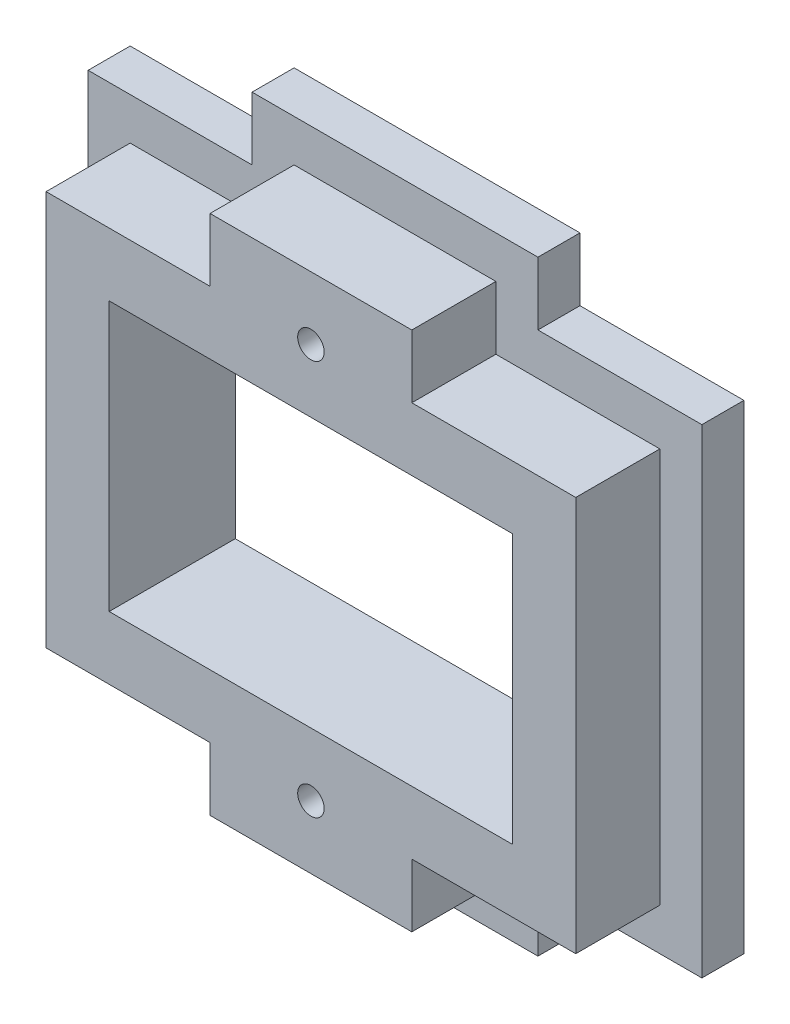
ISO-10303-21;
HEADER;
FILE_DESCRIPTION(('STEP AP214'),'2;1');
FILE_NAME('part.step','',(''),(''),'','','');
FILE_SCHEMA(('AUTOMOTIVE_DESIGN { 1 0 10303 214 1 1 1 1 }'));
ENDSEC;
DATA;
#1=APPLICATION_CONTEXT('core data for automotive mechanical design processes');
#2=APPLICATION_PROTOCOL_DEFINITION('international standard','automotive_design',2000,#1);
#3=PRODUCT_CONTEXT('',#1,'mechanical');
#4=PRODUCT('Part','Part','',(#3));
#5=PRODUCT_RELATED_PRODUCT_CATEGORY('part','',(#4));
#6=PRODUCT_DEFINITION_FORMATION('','',#4);
#7=PRODUCT_DEFINITION_CONTEXT('part definition',#1,'design');
#8=PRODUCT_DEFINITION('design','',#6,#7);
#9=PRODUCT_DEFINITION_SHAPE('','',#8);
#10=(LENGTH_UNIT() NAMED_UNIT(*) SI_UNIT(.MILLI.,.METRE.));
#11=(NAMED_UNIT(*) PLANE_ANGLE_UNIT() SI_UNIT($,.RADIAN.));
#12=(NAMED_UNIT(*) SI_UNIT($,.STERADIAN.) SOLID_ANGLE_UNIT());
#13=UNCERTAINTY_MEASURE_WITH_UNIT(LENGTH_MEASURE(1.E-05),#10,'distance_accuracy_value','');
#14=(GEOMETRIC_REPRESENTATION_CONTEXT(3) GLOBAL_UNCERTAINTY_ASSIGNED_CONTEXT((#13)) GLOBAL_UNIT_ASSIGNED_CONTEXT((#10,
#11,#12)) REPRESENTATION_CONTEXT('',''));
#15=CARTESIAN_POINT('',(0.,0.,0.));
#16=DIRECTION('',(0.,0.,1.));
#17=DIRECTION('',(1.,0.,0.));
#18=AXIS2_PLACEMENT_3D('',#15,#16,#17);
#19=CARTESIAN_POINT('',(0.,-5.08,3.175));
#20=DIRECTION('',(0.,-1.,0.));
#21=DIRECTION('',(1.,0.,0.));
#22=AXIS2_PLACEMENT_3D('',#19,#20,#21);
#23=PLANE('',#22);
#24=DIRECTION('',(0.,0.,-1.));
#25=VECTOR('',#24,1.);
#26=CARTESIAN_POINT('',(7.62,-5.08,3.175));
#27=LINE('',#26,#25);
#28=CARTESIAN_POINT('',(7.62,-5.08,3.175));
#29=VERTEX_POINT('',#28);
#30=CARTESIAN_POINT('',(7.62,-5.08,-1.5875));
#31=VERTEX_POINT('',#30);
#32=EDGE_CURVE('E54',#29,#31,#27,.T.);
#33=ORIENTED_EDGE('',*,*,#32,.T.);
#34=DIRECTION('',(-1.,0.,0.));
#35=VECTOR('',#34,1.);
#36=CARTESIAN_POINT('',(7.62,-5.08,-1.5875));
#37=LINE('',#36,#35);
#38=CARTESIAN_POINT('',(-7.62,-5.08,-1.5875));
#39=VERTEX_POINT('',#38);
#40=EDGE_CURVE('E219',#31,#39,#37,.T.);
#41=ORIENTED_EDGE('',*,*,#40,.T.);
#42=DIRECTION('',(0.,0.,-1.));
#43=VECTOR('',#42,1.);
#44=CARTESIAN_POINT('',(-7.62,-5.08,3.175));
#45=LINE('',#44,#43);
#46=CARTESIAN_POINT('',(-7.62,-5.08,3.175));
#47=VERTEX_POINT('',#46);
#48=EDGE_CURVE('E11',#47,#39,#45,.T.);
#49=ORIENTED_EDGE('',*,*,#48,.F.);
#50=DIRECTION('',(-1.,0.,0.));
#51=VECTOR('',#50,1.);
#52=CARTESIAN_POINT('',(0.,-5.08,3.175));
#53=LINE('',#52,#51);
#54=EDGE_CURVE('E222',#29,#47,#53,.T.);
#55=ORIENTED_EDGE('',*,*,#54,.F.);
#56=EDGE_LOOP('',(#33,#41,#49,#55));
#57=FACE_BOUND('',#56,.T.);
#58=ADVANCED_FACE('F36',(#57),#23,.F.);
#59=CARTESIAN_POINT('',(-7.62,0.,3.175));
#60=DIRECTION('',(-1.,0.,0.));
#61=DIRECTION('',(0.,-1.,0.));
#62=AXIS2_PLACEMENT_3D('',#59,#60,#61);
#63=PLANE('',#62);
#64=ORIENTED_EDGE('',*,*,#48,.T.);
#65=DIRECTION('',(0.,1.,0.));
#66=VECTOR('',#65,1.);
#67=CARTESIAN_POINT('',(-7.62,5.08,-1.5875));
#68=LINE('',#67,#66);
#69=CARTESIAN_POINT('',(-7.62,5.08,-1.5875));
#70=VERTEX_POINT('',#69);
#71=EDGE_CURVE('E235',#39,#70,#68,.T.);
#72=ORIENTED_EDGE('',*,*,#71,.T.);
#73=DIRECTION('',(0.,0.,-1.));
#74=VECTOR('',#73,1.);
#75=CARTESIAN_POINT('',(-7.62,5.08,3.175));
#76=LINE('',#75,#74);
#77=CARTESIAN_POINT('',(-7.62,5.08,3.175));
#78=VERTEX_POINT('',#77);
#79=EDGE_CURVE('E46',#78,#70,#76,.T.);
#80=ORIENTED_EDGE('',*,*,#79,.F.);
#81=DIRECTION('',(0.,1.,0.));
#82=VECTOR('',#81,1.);
#83=CARTESIAN_POINT('',(-7.62,0.,3.175));
#84=LINE('',#83,#82);
#85=EDGE_CURVE('E360',#47,#78,#84,.T.);
#86=ORIENTED_EDGE('',*,*,#85,.F.);
#87=EDGE_LOOP('',(#64,#72,#80,#86));
#88=FACE_BOUND('',#87,.T.);
#89=ADVANCED_FACE('F505',(#88),#63,.F.);
#90=CARTESIAN_POINT('',(0.,5.08,3.175));
#91=DIRECTION('',(0.,-1.,0.));
#92=DIRECTION('',(1.,0.,0.));
#93=AXIS2_PLACEMENT_3D('',#90,#91,#92);
#94=PLANE('',#93);
#95=ORIENTED_EDGE('',*,*,#79,.T.);
#96=DIRECTION('',(1.,0.,0.));
#97=VECTOR('',#96,1.);
#98=CARTESIAN_POINT('',(7.62,5.08,-1.5875));
#99=LINE('',#98,#97);
#100=CARTESIAN_POINT('',(7.62,5.08,-1.5875));
#101=VERTEX_POINT('',#100);
#102=EDGE_CURVE('E237',#70,#101,#99,.T.);
#103=ORIENTED_EDGE('',*,*,#102,.T.);
#104=DIRECTION('',(0.,0.,-1.));
#105=VECTOR('',#104,1.);
#106=CARTESIAN_POINT('',(7.62,5.08,3.175));
#107=LINE('',#106,#105);
#108=CARTESIAN_POINT('',(7.62,5.08,3.175));
#109=VERTEX_POINT('',#108);
#110=EDGE_CURVE('E224',#109,#101,#107,.T.);
#111=ORIENTED_EDGE('',*,*,#110,.F.);
#112=DIRECTION('',(-1.,0.,0.));
#113=VECTOR('',#112,1.);
#114=CARTESIAN_POINT('',(0.,5.08,3.175));
#115=LINE('',#114,#113);
#116=EDGE_CURVE('E362',#109,#78,#115,.T.);
#117=ORIENTED_EDGE('',*,*,#116,.T.);
#118=EDGE_LOOP('',(#95,#103,#111,#117));
#119=FACE_BOUND('',#118,.T.);
#120=ADVANCED_FACE('F510',(#119),#94,.T.);
#121=CARTESIAN_POINT('',(0.,-7.46125,3.175));
#122=DIRECTION('',(0.,-1.,0.));
#123=DIRECTION('',(1.,0.,0.));
#124=AXIS2_PLACEMENT_3D('',#121,#122,#123);
#125=PLANE('',#124);
#126=DIRECTION('',(-1.,0.,0.));
#127=VECTOR('',#126,1.);
#128=CARTESIAN_POINT('',(0.,-7.46125,0.));
#129=LINE('',#128,#127);
#130=CARTESIAN_POINT('',(-3.80999999999999,-7.46125,0.));
#131=VERTEX_POINT('',#130);
#132=CARTESIAN_POINT('',(-10.00125,-7.46125,0.));
#133=VERTEX_POINT('',#132);
#134=EDGE_CURVE('E371',#131,#133,#129,.T.);
#135=ORIENTED_EDGE('',*,*,#134,.F.);
#136=DIRECTION('',(0.,0.,-1.));
#137=VECTOR('',#136,1.);
#138=CARTESIAN_POINT('',(-3.80999999999999,-7.46125,3.175));
#139=LINE('',#138,#137);
#140=CARTESIAN_POINT('',(-3.80999999999999,-7.46125,3.175));
#141=VERTEX_POINT('',#140);
#142=EDGE_CURVE('E40',#141,#131,#139,.T.);
#143=ORIENTED_EDGE('',*,*,#142,.F.);
#144=DIRECTION('',(-1.,0.,0.));
#145=VECTOR('',#144,1.);
#146=CARTESIAN_POINT('',(0.,-7.46125,3.175));
#147=LINE('',#146,#145);
#148=CARTESIAN_POINT('',(-10.00125,-7.46125,3.175));
#149=VERTEX_POINT('',#148);
#150=EDGE_CURVE('E328',#141,#149,#147,.T.);
#151=ORIENTED_EDGE('',*,*,#150,.T.);
#152=DIRECTION('',(0.,0.,-1.));
#153=VECTOR('',#152,1.);
#154=CARTESIAN_POINT('',(-10.00125,-7.46125,3.175));
#155=LINE('',#154,#153);
#156=EDGE_CURVE('E370',#149,#133,#155,.T.);
#157=ORIENTED_EDGE('',*,*,#156,.T.);
#158=EDGE_LOOP('',(#135,#143,#151,#157));
#159=FACE_BOUND('',#158,.T.);
#160=ADVANCED_FACE('F443',(#159),#125,.T.);
#161=CARTESIAN_POINT('',(-3.80999999999999,0.,3.175));
#162=DIRECTION('',(1.,0.,0.));
#163=DIRECTION('',(0.,0.,-1.));
#164=AXIS2_PLACEMENT_3D('',#161,#162,#163);
#165=PLANE('',#164);
#166=DIRECTION('',(0.,-1.,0.));
#167=VECTOR('',#166,1.);
#168=CARTESIAN_POINT('',(-3.80999999999999,0.,0.));
#169=LINE('',#168,#167);
#170=CARTESIAN_POINT('',(-3.80999999999999,-9.84250000000001,0.));
#171=VERTEX_POINT('',#170);
#172=EDGE_CURVE('E373',#131,#171,#169,.T.);
#173=ORIENTED_EDGE('',*,*,#172,.T.);
#174=DIRECTION('',(0.,0.,-1.));
#175=VECTOR('',#174,1.);
#176=CARTESIAN_POINT('',(-3.80999999999999,-9.84250000000001,3.175));
#177=LINE('',#176,#175);
#178=CARTESIAN_POINT('',(-3.80999999999999,-9.84250000000001,3.175));
#179=VERTEX_POINT('',#178);
#180=EDGE_CURVE('E432',#179,#171,#177,.T.);
#181=ORIENTED_EDGE('',*,*,#180,.F.);
#182=DIRECTION('',(0.,-1.,0.));
#183=VECTOR('',#182,1.);
#184=CARTESIAN_POINT('',(-3.80999999999999,0.,3.175));
#185=LINE('',#184,#183);
#186=EDGE_CURVE('E331',#141,#179,#185,.T.);
#187=ORIENTED_EDGE('',*,*,#186,.F.);
#188=ORIENTED_EDGE('',*,*,#142,.T.);
#189=EDGE_LOOP('',(#173,#181,#187,#188));
#190=FACE_BOUND('',#189,.T.);
#191=ADVANCED_FACE('F38',(#190),#165,.F.);
#192=CARTESIAN_POINT('',(0.,-9.84250000000001,3.175));
#193=DIRECTION('',(0.,1.,0.));
#194=DIRECTION('',(0.,0.,1.));
#195=AXIS2_PLACEMENT_3D('',#192,#193,#194);
#196=PLANE('',#195);
#197=DIRECTION('',(1.,0.,0.));
#198=VECTOR('',#197,1.);
#199=CARTESIAN_POINT('',(0.,-9.84250000000001,0.));
#200=LINE('',#199,#198);
#201=CARTESIAN_POINT('',(3.81000000000001,-9.84250000000001,0.));
#202=VERTEX_POINT('',#201);
#203=EDGE_CURVE('E377',#171,#202,#200,.T.);
#204=ORIENTED_EDGE('',*,*,#203,.T.);
#205=DIRECTION('',(0.,0.,-1.));
#206=VECTOR('',#205,1.);
#207=CARTESIAN_POINT('',(3.81000000000001,-9.84250000000001,3.175));
#208=LINE('',#207,#206);
#209=CARTESIAN_POINT('',(3.81000000000001,-9.84250000000001,3.175));
#210=VERTEX_POINT('',#209);
#211=EDGE_CURVE('E430',#210,#202,#208,.T.);
#212=ORIENTED_EDGE('',*,*,#211,.F.);
#213=DIRECTION('',(1.,0.,0.));
#214=VECTOR('',#213,1.);
#215=CARTESIAN_POINT('',(0.,-9.84250000000001,3.175));
#216=LINE('',#215,#214);
#217=EDGE_CURVE('E335',#179,#210,#216,.T.);
#218=ORIENTED_EDGE('',*,*,#217,.F.);
#219=ORIENTED_EDGE('',*,*,#180,.T.);
#220=EDGE_LOOP('',(#204,#212,#218,#219));
#221=FACE_BOUND('',#220,.T.);
#222=ADVANCED_FACE('F451',(#221),#196,.F.);
#223=CARTESIAN_POINT('',(3.81000000000001,0.,3.175));
#224=DIRECTION('',(1.,0.,0.));
#225=DIRECTION('',(0.,0.,-1.));
#226=AXIS2_PLACEMENT_3D('',#223,#224,#225);
#227=PLANE('',#226);
#228=DIRECTION('',(0.,-1.,0.));
#229=VECTOR('',#228,1.);
#230=CARTESIAN_POINT('',(3.81000000000001,0.,0.));
#231=LINE('',#230,#229);
#232=CARTESIAN_POINT('',(3.81000000000001,-7.46125,0.));
#233=VERTEX_POINT('',#232);
#234=EDGE_CURVE('E380',#233,#202,#231,.T.);
#235=ORIENTED_EDGE('',*,*,#234,.F.);
#236=DIRECTION('',(0.,0.,-1.));
#237=VECTOR('',#236,1.);
#238=CARTESIAN_POINT('',(3.81000000000001,-7.46125,3.175));
#239=LINE('',#238,#237);
#240=CARTESIAN_POINT('',(3.81000000000001,-7.46125,3.175));
#241=VERTEX_POINT('',#240);
#242=EDGE_CURVE('E427',#241,#233,#239,.T.);
#243=ORIENTED_EDGE('',*,*,#242,.F.);
#244=DIRECTION('',(0.,-1.,0.));
#245=VECTOR('',#244,1.);
#246=CARTESIAN_POINT('',(3.81000000000001,0.,3.175));
#247=LINE('',#246,#245);
#248=EDGE_CURVE('E337',#241,#210,#247,.T.);
#249=ORIENTED_EDGE('',*,*,#248,.T.);
#250=ORIENTED_EDGE('',*,*,#211,.T.);
#251=EDGE_LOOP('',(#235,#243,#249,#250));
#252=FACE_BOUND('',#251,.T.);
#253=ADVANCED_FACE('F454',(#252),#227,.T.);
#254=CARTESIAN_POINT('',(10.00125,-7.46125,0.));
#255=VERTEX_POINT('',#254);
#256=EDGE_CURVE('E374',#255,#233,#129,.T.);
#257=ORIENTED_EDGE('',*,*,#256,.F.);
#258=DIRECTION('',(0.,0.,-1.));
#259=VECTOR('',#258,1.);
#260=CARTESIAN_POINT('',(10.00125,-7.46125,3.175));
#261=LINE('',#260,#259);
#262=CARTESIAN_POINT('',(10.00125,-7.46125,3.175));
#263=VERTEX_POINT('',#262);
#264=EDGE_CURVE('E424',#263,#255,#261,.T.);
#265=ORIENTED_EDGE('',*,*,#264,.F.);
#266=EDGE_CURVE('E333',#263,#241,#147,.T.);
#267=ORIENTED_EDGE('',*,*,#266,.T.);
#268=ORIENTED_EDGE('',*,*,#242,.T.);
#269=EDGE_LOOP('',(#257,#265,#267,#268));
#270=FACE_BOUND('',#269,.T.);
#271=ADVANCED_FACE('F462',(#270),#125,.T.);
#272=CARTESIAN_POINT('',(10.00125,0.,3.175));
#273=DIRECTION('',(-1.,0.,0.));
#274=DIRECTION('',(0.,0.,1.));
#275=AXIS2_PLACEMENT_3D('',#272,#273,#274);
#276=PLANE('',#275);
#277=DIRECTION('',(0.,1.,0.));
#278=VECTOR('',#277,1.);
#279=CARTESIAN_POINT('',(10.00125,0.,0.));
#280=LINE('',#279,#278);
#281=CARTESIAN_POINT('',(10.00125,7.46125,0.));
#282=VERTEX_POINT('',#281);
#283=EDGE_CURVE('E382',#255,#282,#280,.T.);
#284=ORIENTED_EDGE('',*,*,#283,.T.);
#285=DIRECTION('',(0.,0.,-1.));
#286=VECTOR('',#285,1.);
#287=CARTESIAN_POINT('',(10.00125,7.46125,3.175));
#288=LINE('',#287,#286);
#289=CARTESIAN_POINT('',(10.00125,7.46125,3.175));
#290=VERTEX_POINT('',#289);
#291=EDGE_CURVE('E421',#290,#282,#288,.T.);
#292=ORIENTED_EDGE('',*,*,#291,.F.);
#293=DIRECTION('',(0.,1.,0.));
#294=VECTOR('',#293,1.);
#295=CARTESIAN_POINT('',(10.00125,0.,3.175));
#296=LINE('',#295,#294);
#297=EDGE_CURVE('E340',#263,#290,#296,.T.);
#298=ORIENTED_EDGE('',*,*,#297,.F.);
#299=ORIENTED_EDGE('',*,*,#264,.T.);
#300=EDGE_LOOP('',(#284,#292,#298,#299));
#301=FACE_BOUND('',#300,.T.);
#302=ADVANCED_FACE('F466',(#301),#276,.F.);
#303=CARTESIAN_POINT('',(0.,7.46125,3.175));
#304=DIRECTION('',(0.,-1.,0.));
#305=DIRECTION('',(1.,0.,0.));
#306=AXIS2_PLACEMENT_3D('',#303,#304,#305);
#307=PLANE('',#306);
#308=DIRECTION('',(-1.,0.,0.));
#309=VECTOR('',#308,1.);
#310=CARTESIAN_POINT('',(0.,7.46125,0.));
#311=LINE('',#310,#309);
#312=CARTESIAN_POINT('',(3.81000000000001,7.46125,0.));
#313=VERTEX_POINT('',#312);
#314=EDGE_CURVE('E385',#282,#313,#311,.T.);
#315=ORIENTED_EDGE('',*,*,#314,.T.);
#316=DIRECTION('',(0.,0.,-1.));
#317=VECTOR('',#316,1.);
#318=CARTESIAN_POINT('',(3.81000000000001,7.46125,3.175));
#319=LINE('',#318,#317);
#320=CARTESIAN_POINT('',(3.81000000000001,7.46125,3.175));
#321=VERTEX_POINT('',#320);
#322=EDGE_CURVE('E418',#321,#313,#319,.T.);
#323=ORIENTED_EDGE('',*,*,#322,.F.);
#324=DIRECTION('',(-1.,0.,0.));
#325=VECTOR('',#324,1.);
#326=CARTESIAN_POINT('',(0.,7.46125,3.175));
#327=LINE('',#326,#325);
#328=EDGE_CURVE('E342',#290,#321,#327,.T.);
#329=ORIENTED_EDGE('',*,*,#328,.F.);
#330=ORIENTED_EDGE('',*,*,#291,.T.);
#331=EDGE_LOOP('',(#315,#323,#329,#330));
#332=FACE_BOUND('',#331,.T.);
#333=ADVANCED_FACE('F473',(#332),#307,.F.);
#334=CARTESIAN_POINT('',(3.81000000000001,0.,3.175));
#335=DIRECTION('',(-1.,0.,0.));
#336=DIRECTION('',(0.,0.,1.));
#337=AXIS2_PLACEMENT_3D('',#334,#335,#336);
#338=PLANE('',#337);
#339=DIRECTION('',(0.,1.,0.));
#340=VECTOR('',#339,1.);
#341=CARTESIAN_POINT('',(3.81000000000001,0.,0.));
#342=LINE('',#341,#340);
#343=CARTESIAN_POINT('',(3.81000000000001,9.8425,0.));
#344=VERTEX_POINT('',#343);
#345=EDGE_CURVE('E388',#313,#344,#342,.T.);
#346=ORIENTED_EDGE('',*,*,#345,.T.);
#347=DIRECTION('',(0.,0.,-1.));
#348=VECTOR('',#347,1.);
#349=CARTESIAN_POINT('',(3.81000000000001,9.8425,3.175));
#350=LINE('',#349,#348);
#351=CARTESIAN_POINT('',(3.81000000000001,9.8425,3.175));
#352=VERTEX_POINT('',#351);
#353=EDGE_CURVE('E415',#352,#344,#350,.T.);
#354=ORIENTED_EDGE('',*,*,#353,.F.);
#355=DIRECTION('',(0.,1.,0.));
#356=VECTOR('',#355,1.);
#357=CARTESIAN_POINT('',(3.81000000000001,0.,3.175));
#358=LINE('',#357,#356);
#359=EDGE_CURVE('E344',#321,#352,#358,.T.);
#360=ORIENTED_EDGE('',*,*,#359,.F.);
#361=ORIENTED_EDGE('',*,*,#322,.T.);
#362=EDGE_LOOP('',(#346,#354,#360,#361));
#363=FACE_BOUND('',#362,.T.);
#364=ADVANCED_FACE('F475',(#363),#338,.F.);
#365=CARTESIAN_POINT('',(0.,9.8425,3.175));
#366=DIRECTION('',(0.,1.,0.));
#367=DIRECTION('',(0.,0.,1.));
#368=AXIS2_PLACEMENT_3D('',#365,#366,#367);
#369=PLANE('',#368);
#370=DIRECTION('',(1.,0.,0.));
#371=VECTOR('',#370,1.);
#372=CARTESIAN_POINT('',(0.,9.8425,0.));
#373=LINE('',#372,#371);
#374=CARTESIAN_POINT('',(-3.80999999999999,9.8425,0.));
#375=VERTEX_POINT('',#374);
#376=EDGE_CURVE('E392',#375,#344,#373,.T.);
#377=ORIENTED_EDGE('',*,*,#376,.F.);
#378=DIRECTION('',(0.,0.,-1.));
#379=VECTOR('',#378,1.);
#380=CARTESIAN_POINT('',(-3.80999999999999,9.8425,3.175));
#381=LINE('',#380,#379);
#382=CARTESIAN_POINT('',(-3.80999999999999,9.8425,3.175));
#383=VERTEX_POINT('',#382);
#384=EDGE_CURVE('E412',#383,#375,#381,.T.);
#385=ORIENTED_EDGE('',*,*,#384,.F.);
#386=DIRECTION('',(1.,0.,0.));
#387=VECTOR('',#386,1.);
#388=CARTESIAN_POINT('',(0.,9.8425,3.175));
#389=LINE('',#388,#387);
#390=EDGE_CURVE('E347',#383,#352,#389,.T.);
#391=ORIENTED_EDGE('',*,*,#390,.T.);
#392=ORIENTED_EDGE('',*,*,#353,.T.);
#393=EDGE_LOOP('',(#377,#385,#391,#392));
#394=FACE_BOUND('',#393,.T.);
#395=ADVANCED_FACE('F478',(#394),#369,.T.);
#396=CARTESIAN_POINT('',(-3.80999999999999,0.,3.175));
#397=DIRECTION('',(-1.,0.,0.));
#398=DIRECTION('',(0.,0.,1.));
#399=AXIS2_PLACEMENT_3D('',#396,#397,#398);
#400=PLANE('',#399);
#401=DIRECTION('',(0.,1.,0.));
#402=VECTOR('',#401,1.);
#403=CARTESIAN_POINT('',(-3.80999999999999,0.,0.));
#404=LINE('',#403,#402);
#405=CARTESIAN_POINT('',(-3.80999999999999,7.46125,0.));
#406=VERTEX_POINT('',#405);
#407=EDGE_CURVE('E394',#406,#375,#404,.T.);
#408=ORIENTED_EDGE('',*,*,#407,.F.);
#409=DIRECTION('',(0.,0.,-1.));
#410=VECTOR('',#409,1.);
#411=CARTESIAN_POINT('',(-3.80999999999999,7.46125,3.175));
#412=LINE('',#411,#410);
#413=CARTESIAN_POINT('',(-3.80999999999999,7.46125,3.175));
#414=VERTEX_POINT('',#413);
#415=EDGE_CURVE('E409',#414,#406,#412,.T.);
#416=ORIENTED_EDGE('',*,*,#415,.F.);
#417=DIRECTION('',(0.,1.,0.));
#418=VECTOR('',#417,1.);
#419=CARTESIAN_POINT('',(-3.80999999999999,0.,3.175));
#420=LINE('',#419,#418);
#421=EDGE_CURVE('E350',#414,#383,#420,.T.);
#422=ORIENTED_EDGE('',*,*,#421,.T.);
#423=ORIENTED_EDGE('',*,*,#384,.T.);
#424=EDGE_LOOP('',(#408,#416,#422,#423));
#425=FACE_BOUND('',#424,.T.);
#426=ADVANCED_FACE('F482',(#425),#400,.T.);
#427=CARTESIAN_POINT('',(-10.00125,7.46125,0.));
#428=VERTEX_POINT('',#427);
#429=EDGE_CURVE('E389',#406,#428,#311,.T.);
#430=ORIENTED_EDGE('',*,*,#429,.T.);
#431=DIRECTION('',(0.,0.,-1.));
#432=VECTOR('',#431,1.);
#433=CARTESIAN_POINT('',(-10.00125,7.46125,3.175));
#434=LINE('',#433,#432);
#435=CARTESIAN_POINT('',(-10.00125,7.46125,3.175));
#436=VERTEX_POINT('',#435);
#437=EDGE_CURVE('E406',#436,#428,#434,.T.);
#438=ORIENTED_EDGE('',*,*,#437,.F.);
#439=EDGE_CURVE('E345',#414,#436,#327,.T.);
#440=ORIENTED_EDGE('',*,*,#439,.F.);
#441=ORIENTED_EDGE('',*,*,#415,.T.);
#442=EDGE_LOOP('',(#430,#438,#440,#441));
#443=FACE_BOUND('',#442,.T.);
#444=ADVANCED_FACE('F487',(#443),#307,.F.);
#445=CARTESIAN_POINT('',(7.62,0.,3.175));
#446=DIRECTION('',(-1.,0.,0.));
#447=DIRECTION('',(0.,-1.,0.));
#448=AXIS2_PLACEMENT_3D('',#445,#446,#447);
#449=PLANE('',#448);
#450=ORIENTED_EDGE('',*,*,#110,.T.);
#451=DIRECTION('',(0.,-1.,0.));
#452=VECTOR('',#451,1.);
#453=CARTESIAN_POINT('',(7.62,5.08,-1.5875));
#454=LINE('',#453,#452);
#455=EDGE_CURVE('E227',#101,#31,#454,.T.);
#456=ORIENTED_EDGE('',*,*,#455,.T.);
#457=ORIENTED_EDGE('',*,*,#32,.F.);
#458=DIRECTION('',(0.,1.,0.));
#459=VECTOR('',#458,1.);
#460=CARTESIAN_POINT('',(7.62,0.,3.175));
#461=LINE('',#460,#459);
#462=EDGE_CURVE('E365',#29,#109,#461,.T.);
#463=ORIENTED_EDGE('',*,*,#462,.T.);
#464=EDGE_LOOP('',(#450,#456,#457,#463));
#465=FACE_BOUND('',#464,.T.);
#466=ADVANCED_FACE('F228',(#465),#449,.T.);
#467=CARTESIAN_POINT('',(0.,7.46125,3.175));
#468=DIRECTION('',(0.,0.,-1.));
#469=DIRECTION('',(-1.,0.,0.));
#470=AXIS2_PLACEMENT_3D('',#467,#468,#469);
#471=CYLINDRICAL_SURFACE('',#470,0.5);
#472=CARTESIAN_POINT('',(0.,7.46125,3.175));
#473=DIRECTION('',(0.,0.,1.));
#474=DIRECTION('',(1.,0.,0.));
#475=AXIS2_PLACEMENT_3D('',#472,#473,#474);
#476=CIRCLE('',#475,0.5);
#477=CARTESIAN_POINT('',(0.5,7.46125,3.175));
#478=VERTEX_POINT('',#477);
#479=EDGE_CURVE('E356',#478,#478,#476,.T.);
#480=ORIENTED_EDGE('',*,*,#479,.T.);
#481=EDGE_LOOP('',(#480));
#482=FACE_BOUND('',#481,.T.);
#483=CARTESIAN_POINT('',(0.,7.46125,0.));
#484=DIRECTION('',(0.,0.,1.));
#485=DIRECTION('',(1.,0.,0.));
#486=AXIS2_PLACEMENT_3D('',#483,#484,#485);
#487=CIRCLE('',#486,0.5);
#488=CARTESIAN_POINT('',(0.5,7.46125,0.));
#489=VERTEX_POINT('',#488);
#490=EDGE_CURVE('E332',#489,#489,#487,.T.);
#491=ORIENTED_EDGE('',*,*,#490,.F.);
#492=EDGE_LOOP('',(#491));
#493=FACE_BOUND('',#492,.T.);
#494=ADVANCED_FACE('F493',(#482,#493),#471,.F.);
#495=CARTESIAN_POINT('',(-10.00125,0.,3.175));
#496=DIRECTION('',(-1.,0.,0.));
#497=DIRECTION('',(0.,0.,1.));
#498=AXIS2_PLACEMENT_3D('',#495,#496,#497);
#499=PLANE('',#498);
#500=DIRECTION('',(0.,1.,0.));
#501=VECTOR('',#500,1.);
#502=CARTESIAN_POINT('',(-10.00125,0.,0.));
#503=LINE('',#502,#501);
#504=EDGE_CURVE('E396',#133,#428,#503,.T.);
#505=ORIENTED_EDGE('',*,*,#504,.F.);
#506=ORIENTED_EDGE('',*,*,#156,.F.);
#507=DIRECTION('',(0.,1.,0.));
#508=VECTOR('',#507,1.);
#509=CARTESIAN_POINT('',(-10.00125,0.,3.175));
#510=LINE('',#509,#508);
#511=EDGE_CURVE('E353',#149,#436,#510,.T.);
#512=ORIENTED_EDGE('',*,*,#511,.T.);
#513=ORIENTED_EDGE('',*,*,#437,.T.);
#514=EDGE_LOOP('',(#505,#506,#512,#513));
#515=FACE_BOUND('',#514,.T.);
#516=ADVANCED_FACE('F490',(#515),#499,.T.);
#517=CARTESIAN_POINT('',(0.,-7.46125,3.175));
#518=DIRECTION('',(0.,0.,-1.));
#519=DIRECTION('',(-1.,0.,0.));
#520=AXIS2_PLACEMENT_3D('',#517,#518,#519);
#521=CYLINDRICAL_SURFACE('',#520,0.5);
#522=CARTESIAN_POINT('',(0.,-7.46125,3.175));
#523=DIRECTION('',(0.,0.,1.));
#524=DIRECTION('',(1.,0.,0.));
#525=AXIS2_PLACEMENT_3D('',#522,#523,#524);
#526=CIRCLE('',#525,0.5);
#527=CARTESIAN_POINT('',(0.5,-7.46125,3.175));
#528=VERTEX_POINT('',#527);
#529=EDGE_CURVE('E367',#528,#528,#526,.F.);
#530=ORIENTED_EDGE('',*,*,#529,.F.);
#531=EDGE_LOOP('',(#530));
#532=FACE_BOUND('',#531,.T.);
#533=CARTESIAN_POINT('',(0.,-7.46125,0.));
#534=DIRECTION('',(0.,0.,1.));
#535=DIRECTION('',(1.,0.,0.));
#536=AXIS2_PLACEMENT_3D('',#533,#534,#535);
#537=CIRCLE('',#536,0.5);
#538=CARTESIAN_POINT('',(0.5,-7.46125,0.));
#539=VERTEX_POINT('',#538);
#540=EDGE_CURVE('E327',#539,#539,#537,.F.);
#541=ORIENTED_EDGE('',*,*,#540,.T.);
#542=EDGE_LOOP('',(#541));
#543=FACE_BOUND('',#542,.T.);
#544=ADVANCED_FACE('F492',(#532,#543),#521,.F.);
#545=CARTESIAN_POINT('',(0.,0.,3.175));
#546=DIRECTION('',(0.,0.,1.));
#547=DIRECTION('',(1.,0.,0.));
#548=AXIS2_PLACEMENT_3D('',#545,#546,#547);
#549=PLANE('',#548);
#550=ORIENTED_EDGE('',*,*,#150,.F.);
#551=ORIENTED_EDGE('',*,*,#186,.T.);
#552=ORIENTED_EDGE('',*,*,#217,.T.);
#553=ORIENTED_EDGE('',*,*,#248,.F.);
#554=ORIENTED_EDGE('',*,*,#266,.F.);
#555=ORIENTED_EDGE('',*,*,#297,.T.);
#556=ORIENTED_EDGE('',*,*,#328,.T.);
#557=ORIENTED_EDGE('',*,*,#359,.T.);
#558=ORIENTED_EDGE('',*,*,#390,.F.);
#559=ORIENTED_EDGE('',*,*,#421,.F.);
#560=ORIENTED_EDGE('',*,*,#439,.T.);
#561=ORIENTED_EDGE('',*,*,#511,.F.);
#562=EDGE_LOOP('',(#550,#551,#552,#553,#554,#555,#556,#557,#558,#559,#560,#561));
#563=FACE_BOUND('',#562,.T.);
#564=ORIENTED_EDGE('',*,*,#479,.F.);
#565=EDGE_LOOP('',(#564));
#566=FACE_BOUND('',#565,.T.);
#567=ORIENTED_EDGE('',*,*,#54,.T.);
#568=ORIENTED_EDGE('',*,*,#85,.T.);
#569=ORIENTED_EDGE('',*,*,#116,.F.);
#570=ORIENTED_EDGE('',*,*,#462,.F.);
#571=EDGE_LOOP('',(#567,#568,#569,#570));
#572=FACE_BOUND('',#571,.T.);
#573=ORIENTED_EDGE('',*,*,#529,.T.);
#574=EDGE_LOOP('',(#573));
#575=FACE_BOUND('',#574,.T.);
#576=ADVANCED_FACE('F458',(#563,#566,#572,#575),#549,.T.);
#577=CARTESIAN_POINT('',(0.,0.,0.));
#578=DIRECTION('',(0.,0.,1.));
#579=DIRECTION('',(1.,0.,0.));
#580=AXIS2_PLACEMENT_3D('',#577,#578,#579);
#581=PLANE('',#580);
#582=ORIENTED_EDGE('',*,*,#540,.F.);
#583=EDGE_LOOP('',(#582));
#584=FACE_BOUND('',#583,.T.);
#585=ADVANCED_FACE('F521',(#584),#581,.T.);
#586=ORIENTED_EDGE('',*,*,#490,.T.);
#587=EDGE_LOOP('',(#586));
#588=FACE_BOUND('',#587,.T.);
#589=ADVANCED_FACE('F570',(#588),#581,.T.);
#590=ORIENTED_EDGE('',*,*,#172,.F.);
#591=ORIENTED_EDGE('',*,*,#134,.T.);
#592=ORIENTED_EDGE('',*,*,#504,.T.);
#593=ORIENTED_EDGE('',*,*,#429,.F.);
#594=ORIENTED_EDGE('',*,*,#407,.T.);
#595=ORIENTED_EDGE('',*,*,#376,.T.);
#596=ORIENTED_EDGE('',*,*,#345,.F.);
#597=ORIENTED_EDGE('',*,*,#314,.F.);
#598=ORIENTED_EDGE('',*,*,#283,.F.);
#599=ORIENTED_EDGE('',*,*,#256,.T.);
#600=ORIENTED_EDGE('',*,*,#234,.T.);
#601=ORIENTED_EDGE('',*,*,#203,.F.);
#602=EDGE_LOOP('',(#590,#591,#592,#593,#594,#595,#596,#597,#598,#599,#600,#601));
#603=FACE_BOUND('',#602,.T.);
#604=DIRECTION('',(0.,1.,0.));
#605=VECTOR('',#604,1.);
#606=CARTESIAN_POINT('',(-5.3975,-11.43,0.));
#607=LINE('',#606,#605);
#608=CARTESIAN_POINT('',(-5.3975,-11.43,0.));
#609=VERTEX_POINT('',#608);
#610=CARTESIAN_POINT('',(-5.3975,-9.04875,0.));
#611=VERTEX_POINT('',#610);
#612=EDGE_CURVE('E241',#609,#611,#607,.T.);
#613=ORIENTED_EDGE('',*,*,#612,.F.);
#614=DIRECTION('',(-1.,0.,0.));
#615=VECTOR('',#614,1.);
#616=CARTESIAN_POINT('',(5.3975,-11.43,0.));
#617=LINE('',#616,#615);
#618=CARTESIAN_POINT('',(5.3975,-11.43,0.));
#619=VERTEX_POINT('',#618);
#620=EDGE_CURVE('E246',#619,#609,#617,.T.);
#621=ORIENTED_EDGE('',*,*,#620,.F.);
#622=DIRECTION('',(0.,-1.,0.));
#623=VECTOR('',#622,1.);
#624=CARTESIAN_POINT('',(5.3975,-9.04875000000001,0.));
#625=LINE('',#624,#623);
#626=CARTESIAN_POINT('',(5.3975,-9.04875000000001,0.));
#627=VERTEX_POINT('',#626);
#628=EDGE_CURVE('E289',#627,#619,#625,.T.);
#629=ORIENTED_EDGE('',*,*,#628,.F.);
#630=DIRECTION('',(-1.,0.,0.));
#631=VECTOR('',#630,1.);
#632=CARTESIAN_POINT('',(11.58875,-9.04875000000001,0.));
#633=LINE('',#632,#631);
#634=CARTESIAN_POINT('',(11.58875,-9.04875000000001,0.));
#635=VERTEX_POINT('',#634);
#636=EDGE_CURVE('E287',#635,#627,#633,.T.);
#637=ORIENTED_EDGE('',*,*,#636,.F.);
#638=DIRECTION('',(0.,-1.,0.));
#639=VECTOR('',#638,1.);
#640=CARTESIAN_POINT('',(11.58875,9.04875,0.));
#641=LINE('',#640,#639);
#642=CARTESIAN_POINT('',(11.58875,9.04875,0.));
#643=VERTEX_POINT('',#642);
#644=EDGE_CURVE('E285',#643,#635,#641,.T.);
#645=ORIENTED_EDGE('',*,*,#644,.F.);
#646=DIRECTION('',(1.,0.,0.));
#647=VECTOR('',#646,1.);
#648=CARTESIAN_POINT('',(5.3975,9.04874999999999,0.));
#649=LINE('',#648,#647);
#650=CARTESIAN_POINT('',(5.3975,9.04874999999999,0.));
#651=VERTEX_POINT('',#650);
#652=EDGE_CURVE('E283',#651,#643,#649,.T.);
#653=ORIENTED_EDGE('',*,*,#652,.F.);
#654=DIRECTION('',(0.,-1.,0.));
#655=VECTOR('',#654,1.);
#656=CARTESIAN_POINT('',(5.3975,11.43,0.));
#657=LINE('',#656,#655);
#658=CARTESIAN_POINT('',(5.3975,11.43,0.));
#659=VERTEX_POINT('',#658);
#660=EDGE_CURVE('E281',#659,#651,#657,.T.);
#661=ORIENTED_EDGE('',*,*,#660,.F.);
#662=DIRECTION('',(1.,0.,0.));
#663=VECTOR('',#662,1.);
#664=CARTESIAN_POINT('',(-5.3975,11.43,0.));
#665=LINE('',#664,#663);
#666=CARTESIAN_POINT('',(-5.3975,11.43,0.));
#667=VERTEX_POINT('',#666);
#668=EDGE_CURVE('E279',#667,#659,#665,.T.);
#669=ORIENTED_EDGE('',*,*,#668,.F.);
#670=DIRECTION('',(0.,1.,0.));
#671=VECTOR('',#670,1.);
#672=CARTESIAN_POINT('',(-5.3975,9.04874999999999,0.));
#673=LINE('',#672,#671);
#674=CARTESIAN_POINT('',(-5.3975,9.04874999999999,0.));
#675=VERTEX_POINT('',#674);
#676=EDGE_CURVE('E277',#675,#667,#673,.T.);
#677=ORIENTED_EDGE('',*,*,#676,.F.);
#678=DIRECTION('',(1.,0.,0.));
#679=VECTOR('',#678,1.);
#680=CARTESIAN_POINT('',(-11.58875,9.04874999999999,0.));
#681=LINE('',#680,#679);
#682=CARTESIAN_POINT('',(-11.58875,9.04874999999999,0.));
#683=VERTEX_POINT('',#682);
#684=EDGE_CURVE('E275',#683,#675,#681,.T.);
#685=ORIENTED_EDGE('',*,*,#684,.F.);
#686=DIRECTION('',(0.,1.,0.));
#687=VECTOR('',#686,1.);
#688=CARTESIAN_POINT('',(-11.58875,-9.04875,0.));
#689=LINE('',#688,#687);
#690=CARTESIAN_POINT('',(-11.58875,-9.04875,0.));
#691=VERTEX_POINT('',#690);
#692=EDGE_CURVE('E273',#691,#683,#689,.T.);
#693=ORIENTED_EDGE('',*,*,#692,.F.);
#694=DIRECTION('',(-1.,0.,0.));
#695=VECTOR('',#694,1.);
#696=CARTESIAN_POINT('',(-5.3975,-9.04875,0.));
#697=LINE('',#696,#695);
#698=EDGE_CURVE('E271',#611,#691,#697,.T.);
#699=ORIENTED_EDGE('',*,*,#698,.F.);
#700=EDGE_LOOP('',(#613,#621,#629,#637,#645,#653,#661,#669,#677,#685,#693,#699));
#701=FACE_BOUND('',#700,.T.);
#702=ADVANCED_FACE('F446',(#603,#701),#581,.T.);
#703=CARTESIAN_POINT('',(0.,0.,-1.5875));
#704=DIRECTION('',(0.,0.,1.));
#705=DIRECTION('',(1.,0.,0.));
#706=AXIS2_PLACEMENT_3D('',#703,#704,#705);
#707=PLANE('',#706);
#708=DIRECTION('',(0.,1.,0.));
#709=VECTOR('',#708,1.);
#710=CARTESIAN_POINT('',(-5.3975,-11.43,-1.5875));
#711=LINE('',#710,#709);
#712=CARTESIAN_POINT('',(-5.3975,-11.43,-1.5875));
#713=VERTEX_POINT('',#712);
#714=CARTESIAN_POINT('',(-5.3975,-9.04875,-1.5875));
#715=VERTEX_POINT('',#714);
#716=EDGE_CURVE('E242',#713,#715,#711,.T.);
#717=ORIENTED_EDGE('',*,*,#716,.T.);
#718=DIRECTION('',(-1.,0.,0.));
#719=VECTOR('',#718,1.);
#720=CARTESIAN_POINT('',(-5.3975,-9.04875,-1.5875));
#721=LINE('',#720,#719);
#722=CARTESIAN_POINT('',(-11.58875,-9.04875,-1.5875));
#723=VERTEX_POINT('',#722);
#724=EDGE_CURVE('E245',#715,#723,#721,.T.);
#725=ORIENTED_EDGE('',*,*,#724,.T.);
#726=DIRECTION('',(0.,1.,0.));
#727=VECTOR('',#726,1.);
#728=CARTESIAN_POINT('',(-11.58875,-9.04875,-1.5875));
#729=LINE('',#728,#727);
#730=CARTESIAN_POINT('',(-11.58875,9.04874999999999,-1.5875));
#731=VERTEX_POINT('',#730);
#732=EDGE_CURVE('E248',#723,#731,#729,.T.);
#733=ORIENTED_EDGE('',*,*,#732,.T.);
#734=DIRECTION('',(1.,0.,0.));
#735=VECTOR('',#734,1.);
#736=CARTESIAN_POINT('',(-11.58875,9.04874999999999,-1.5875));
#737=LINE('',#736,#735);
#738=CARTESIAN_POINT('',(-5.3975,9.04874999999999,-1.5875));
#739=VERTEX_POINT('',#738);
#740=EDGE_CURVE('E250',#731,#739,#737,.T.);
#741=ORIENTED_EDGE('',*,*,#740,.T.);
#742=DIRECTION('',(0.,1.,0.));
#743=VECTOR('',#742,1.);
#744=CARTESIAN_POINT('',(-5.3975,9.04874999999999,-1.5875));
#745=LINE('',#744,#743);
#746=CARTESIAN_POINT('',(-5.3975,11.43,-1.5875));
#747=VERTEX_POINT('',#746);
#748=EDGE_CURVE('E252',#739,#747,#745,.T.);
#749=ORIENTED_EDGE('',*,*,#748,.T.);
#750=DIRECTION('',(1.,0.,0.));
#751=VECTOR('',#750,1.);
#752=CARTESIAN_POINT('',(-5.3975,11.43,-1.5875));
#753=LINE('',#752,#751);
#754=CARTESIAN_POINT('',(5.3975,11.43,-1.5875));
#755=VERTEX_POINT('',#754);
#756=EDGE_CURVE('E254',#747,#755,#753,.T.);
#757=ORIENTED_EDGE('',*,*,#756,.T.);
#758=DIRECTION('',(0.,-1.,0.));
#759=VECTOR('',#758,1.);
#760=CARTESIAN_POINT('',(5.3975,11.43,-1.5875));
#761=LINE('',#760,#759);
#762=CARTESIAN_POINT('',(5.3975,9.04874999999999,-1.5875));
#763=VERTEX_POINT('',#762);
#764=EDGE_CURVE('E256',#755,#763,#761,.T.);
#765=ORIENTED_EDGE('',*,*,#764,.T.);
#766=DIRECTION('',(1.,0.,0.));
#767=VECTOR('',#766,1.);
#768=CARTESIAN_POINT('',(5.3975,9.04874999999999,-1.5875));
#769=LINE('',#768,#767);
#770=CARTESIAN_POINT('',(11.58875,9.04875,-1.5875));
#771=VERTEX_POINT('',#770);
#772=EDGE_CURVE('E258',#763,#771,#769,.T.);
#773=ORIENTED_EDGE('',*,*,#772,.T.);
#774=DIRECTION('',(0.,-1.,0.));
#775=VECTOR('',#774,1.);
#776=CARTESIAN_POINT('',(11.58875,9.04875,-1.5875));
#777=LINE('',#776,#775);
#778=CARTESIAN_POINT('',(11.58875,-9.04875000000001,-1.5875));
#779=VERTEX_POINT('',#778);
#780=EDGE_CURVE('E260',#771,#779,#777,.T.);
#781=ORIENTED_EDGE('',*,*,#780,.T.);
#782=DIRECTION('',(-1.,0.,0.));
#783=VECTOR('',#782,1.);
#784=CARTESIAN_POINT('',(11.58875,-9.04875000000001,-1.5875));
#785=LINE('',#784,#783);
#786=CARTESIAN_POINT('',(5.3975,-9.04875000000001,-1.5875));
#787=VERTEX_POINT('',#786);
#788=EDGE_CURVE('E262',#779,#787,#785,.T.);
#789=ORIENTED_EDGE('',*,*,#788,.T.);
#790=DIRECTION('',(0.,-1.,0.));
#791=VECTOR('',#790,1.);
#792=CARTESIAN_POINT('',(5.3975,-9.04875000000001,-1.5875));
#793=LINE('',#792,#791);
#794=CARTESIAN_POINT('',(5.3975,-11.43,-1.5875));
#795=VERTEX_POINT('',#794);
#796=EDGE_CURVE('E264',#787,#795,#793,.T.);
#797=ORIENTED_EDGE('',*,*,#796,.T.);
#798=DIRECTION('',(-1.,0.,0.));
#799=VECTOR('',#798,1.);
#800=CARTESIAN_POINT('',(5.3975,-11.43,-1.5875));
#801=LINE('',#800,#799);
#802=EDGE_CURVE('E266',#795,#713,#801,.T.);
#803=ORIENTED_EDGE('',*,*,#802,.T.);
#804=EDGE_LOOP('',(#717,#725,#733,#741,#749,#757,#765,#773,#781,#789,#797,#803));
#805=FACE_BOUND('',#804,.T.);
#806=ORIENTED_EDGE('',*,*,#455,.F.);
#807=ORIENTED_EDGE('',*,*,#102,.F.);
#808=ORIENTED_EDGE('',*,*,#71,.F.);
#809=ORIENTED_EDGE('',*,*,#40,.F.);
#810=EDGE_LOOP('',(#806,#807,#808,#809));
#811=FACE_BOUND('',#810,.T.);
#812=ADVANCED_FACE('F233',(#805,#811),#707,.F.);
#813=CARTESIAN_POINT('',(-5.3975,-11.43,-1.5875));
#814=DIRECTION('',(1.,0.,0.));
#815=DIRECTION('',(0.,0.,-1.));
#816=AXIS2_PLACEMENT_3D('',#813,#814,#815);
#817=PLANE('',#816);
#818=ORIENTED_EDGE('',*,*,#612,.T.);
#819=DIRECTION('',(0.,0.,1.));
#820=VECTOR('',#819,1.);
#821=CARTESIAN_POINT('',(-5.3975,-9.04875,-1.5875));
#822=LINE('',#821,#820);
#823=EDGE_CURVE('E324',#715,#611,#822,.T.);
#824=ORIENTED_EDGE('',*,*,#823,.F.);
#825=ORIENTED_EDGE('',*,*,#716,.F.);
#826=DIRECTION('',(0.,0.,1.));
#827=VECTOR('',#826,1.);
#828=CARTESIAN_POINT('',(-5.3975,-11.43,-1.5875));
#829=LINE('',#828,#827);
#830=EDGE_CURVE('E268',#713,#609,#829,.T.);
#831=ORIENTED_EDGE('',*,*,#830,.T.);
#832=EDGE_LOOP('',(#818,#824,#825,#831));
#833=FACE_BOUND('',#832,.T.);
#834=ADVANCED_FACE('F522',(#833),#817,.F.);
#835=CARTESIAN_POINT('',(-5.3975,-9.04875,-1.5875));
#836=DIRECTION('',(0.,1.,0.));
#837=DIRECTION('',(0.,0.,1.));
#838=AXIS2_PLACEMENT_3D('',#835,#836,#837);
#839=PLANE('',#838);
#840=ORIENTED_EDGE('',*,*,#698,.T.);
#841=DIRECTION('',(0.,0.,1.));
#842=VECTOR('',#841,1.);
#843=CARTESIAN_POINT('',(-11.58875,-9.04875,-1.5875));
#844=LINE('',#843,#842);
#845=EDGE_CURVE('E321',#723,#691,#844,.T.);
#846=ORIENTED_EDGE('',*,*,#845,.F.);
#847=ORIENTED_EDGE('',*,*,#724,.F.);
#848=ORIENTED_EDGE('',*,*,#823,.T.);
#849=EDGE_LOOP('',(#840,#846,#847,#848));
#850=FACE_BOUND('',#849,.T.);
#851=ADVANCED_FACE('F525',(#850),#839,.F.);
#852=CARTESIAN_POINT('',(-11.58875,-9.04875,-1.5875));
#853=DIRECTION('',(1.,0.,0.));
#854=DIRECTION('',(0.,0.,-1.));
#855=AXIS2_PLACEMENT_3D('',#852,#853,#854);
#856=PLANE('',#855);
#857=ORIENTED_EDGE('',*,*,#692,.T.);
#858=DIRECTION('',(0.,0.,1.));
#859=VECTOR('',#858,1.);
#860=CARTESIAN_POINT('',(-11.58875,9.04874999999999,-1.5875));
#861=LINE('',#860,#859);
#862=EDGE_CURVE('E318',#731,#683,#861,.T.);
#863=ORIENTED_EDGE('',*,*,#862,.F.);
#864=ORIENTED_EDGE('',*,*,#732,.F.);
#865=ORIENTED_EDGE('',*,*,#845,.T.);
#866=EDGE_LOOP('',(#857,#863,#864,#865));
#867=FACE_BOUND('',#866,.T.);
#868=ADVANCED_FACE('F529',(#867),#856,.F.);
#869=CARTESIAN_POINT('',(-11.58875,9.04874999999999,-1.5875));
#870=DIRECTION('',(0.,-1.,0.));
#871=DIRECTION('',(0.,0.,-1.));
#872=AXIS2_PLACEMENT_3D('',#869,#870,#871);
#873=PLANE('',#872);
#874=ORIENTED_EDGE('',*,*,#684,.T.);
#875=DIRECTION('',(0.,0.,1.));
#876=VECTOR('',#875,1.);
#877=CARTESIAN_POINT('',(-5.3975,9.04874999999999,-1.5875));
#878=LINE('',#877,#876);
#879=EDGE_CURVE('E315',#739,#675,#878,.T.);
#880=ORIENTED_EDGE('',*,*,#879,.F.);
#881=ORIENTED_EDGE('',*,*,#740,.F.);
#882=ORIENTED_EDGE('',*,*,#862,.T.);
#883=EDGE_LOOP('',(#874,#880,#881,#882));
#884=FACE_BOUND('',#883,.T.);
#885=ADVANCED_FACE('F533',(#884),#873,.F.);
#886=CARTESIAN_POINT('',(-5.3975,9.04874999999999,-1.5875));
#887=DIRECTION('',(1.,0.,0.));
#888=DIRECTION('',(0.,0.,-1.));
#889=AXIS2_PLACEMENT_3D('',#886,#887,#888);
#890=PLANE('',#889);
#891=ORIENTED_EDGE('',*,*,#676,.T.);
#892=DIRECTION('',(0.,0.,1.));
#893=VECTOR('',#892,1.);
#894=CARTESIAN_POINT('',(-5.3975,11.43,-1.5875));
#895=LINE('',#894,#893);
#896=EDGE_CURVE('E312',#747,#667,#895,.T.);
#897=ORIENTED_EDGE('',*,*,#896,.F.);
#898=ORIENTED_EDGE('',*,*,#748,.F.);
#899=ORIENTED_EDGE('',*,*,#879,.T.);
#900=EDGE_LOOP('',(#891,#897,#898,#899));
#901=FACE_BOUND('',#900,.T.);
#902=ADVANCED_FACE('F537',(#901),#890,.F.);
#903=CARTESIAN_POINT('',(-5.3975,11.43,-1.5875));
#904=DIRECTION('',(0.,-1.,0.));
#905=DIRECTION('',(0.,0.,-1.));
#906=AXIS2_PLACEMENT_3D('',#903,#904,#905);
#907=PLANE('',#906);
#908=ORIENTED_EDGE('',*,*,#668,.T.);
#909=DIRECTION('',(0.,0.,1.));
#910=VECTOR('',#909,1.);
#911=CARTESIAN_POINT('',(5.3975,11.43,-1.5875));
#912=LINE('',#911,#910);
#913=EDGE_CURVE('E309',#755,#659,#912,.T.);
#914=ORIENTED_EDGE('',*,*,#913,.F.);
#915=ORIENTED_EDGE('',*,*,#756,.F.);
#916=ORIENTED_EDGE('',*,*,#896,.T.);
#917=EDGE_LOOP('',(#908,#914,#915,#916));
#918=FACE_BOUND('',#917,.T.);
#919=ADVANCED_FACE('F541',(#918),#907,.F.);
#920=CARTESIAN_POINT('',(5.3975,11.43,-1.5875));
#921=DIRECTION('',(-1.,0.,0.));
#922=DIRECTION('',(0.,0.,1.));
#923=AXIS2_PLACEMENT_3D('',#920,#921,#922);
#924=PLANE('',#923);
#925=ORIENTED_EDGE('',*,*,#660,.T.);
#926=DIRECTION('',(0.,0.,1.));
#927=VECTOR('',#926,1.);
#928=CARTESIAN_POINT('',(5.3975,9.04874999999999,-1.5875));
#929=LINE('',#928,#927);
#930=EDGE_CURVE('E306',#763,#651,#929,.T.);
#931=ORIENTED_EDGE('',*,*,#930,.F.);
#932=ORIENTED_EDGE('',*,*,#764,.F.);
#933=ORIENTED_EDGE('',*,*,#913,.T.);
#934=EDGE_LOOP('',(#925,#931,#932,#933));
#935=FACE_BOUND('',#934,.T.);
#936=ADVANCED_FACE('F545',(#935),#924,.F.);
#937=CARTESIAN_POINT('',(5.3975,9.04874999999999,-1.5875));
#938=DIRECTION('',(0.,-1.,0.));
#939=DIRECTION('',(1.,0.,0.));
#940=AXIS2_PLACEMENT_3D('',#937,#938,#939);
#941=PLANE('',#940);
#942=ORIENTED_EDGE('',*,*,#652,.T.);
#943=DIRECTION('',(0.,0.,1.));
#944=VECTOR('',#943,1.);
#945=CARTESIAN_POINT('',(11.58875,9.04875,-1.5875));
#946=LINE('',#945,#944);
#947=EDGE_CURVE('E303',#771,#643,#946,.T.);
#948=ORIENTED_EDGE('',*,*,#947,.F.);
#949=ORIENTED_EDGE('',*,*,#772,.F.);
#950=ORIENTED_EDGE('',*,*,#930,.T.);
#951=EDGE_LOOP('',(#942,#948,#949,#950));
#952=FACE_BOUND('',#951,.T.);
#953=ADVANCED_FACE('F549',(#952),#941,.F.);
#954=CARTESIAN_POINT('',(11.58875,9.04875,-1.5875));
#955=DIRECTION('',(-1.,0.,0.));
#956=DIRECTION('',(0.,0.,1.));
#957=AXIS2_PLACEMENT_3D('',#954,#955,#956);
#958=PLANE('',#957);
#959=ORIENTED_EDGE('',*,*,#644,.T.);
#960=DIRECTION('',(0.,0.,1.));
#961=VECTOR('',#960,1.);
#962=CARTESIAN_POINT('',(11.58875,-9.04875000000001,-1.5875));
#963=LINE('',#962,#961);
#964=EDGE_CURVE('E300',#779,#635,#963,.T.);
#965=ORIENTED_EDGE('',*,*,#964,.F.);
#966=ORIENTED_EDGE('',*,*,#780,.F.);
#967=ORIENTED_EDGE('',*,*,#947,.T.);
#968=EDGE_LOOP('',(#959,#965,#966,#967));
#969=FACE_BOUND('',#968,.T.);
#970=ADVANCED_FACE('F553',(#969),#958,.F.);
#971=CARTESIAN_POINT('',(11.58875,-9.04875000000001,-1.5875));
#972=DIRECTION('',(0.,1.,0.));
#973=DIRECTION('',(0.,0.,1.));
#974=AXIS2_PLACEMENT_3D('',#971,#972,#973);
#975=PLANE('',#974);
#976=ORIENTED_EDGE('',*,*,#636,.T.);
#977=DIRECTION('',(0.,0.,1.));
#978=VECTOR('',#977,1.);
#979=CARTESIAN_POINT('',(5.3975,-9.04875000000001,-1.5875));
#980=LINE('',#979,#978);
#981=EDGE_CURVE('E297',#787,#627,#980,.T.);
#982=ORIENTED_EDGE('',*,*,#981,.F.);
#983=ORIENTED_EDGE('',*,*,#788,.F.);
#984=ORIENTED_EDGE('',*,*,#964,.T.);
#985=EDGE_LOOP('',(#976,#982,#983,#984));
#986=FACE_BOUND('',#985,.T.);
#987=ADVANCED_FACE('F557',(#986),#975,.F.);
#988=CARTESIAN_POINT('',(5.3975,-9.04875000000001,-1.5875));
#989=DIRECTION('',(-1.,0.,0.));
#990=DIRECTION('',(0.,0.,1.));
#991=AXIS2_PLACEMENT_3D('',#988,#989,#990);
#992=PLANE('',#991);
#993=ORIENTED_EDGE('',*,*,#628,.T.);
#994=DIRECTION('',(0.,0.,1.));
#995=VECTOR('',#994,1.);
#996=CARTESIAN_POINT('',(5.3975,-11.43,-1.5875));
#997=LINE('',#996,#995);
#998=EDGE_CURVE('E294',#795,#619,#997,.T.);
#999=ORIENTED_EDGE('',*,*,#998,.F.);
#1000=ORIENTED_EDGE('',*,*,#796,.F.);
#1001=ORIENTED_EDGE('',*,*,#981,.T.);
#1002=EDGE_LOOP('',(#993,#999,#1000,#1001));
#1003=FACE_BOUND('',#1002,.T.);
#1004=ADVANCED_FACE('F561',(#1003),#992,.F.);
#1005=CARTESIAN_POINT('',(5.3975,-11.43,-1.5875));
#1006=DIRECTION('',(0.,1.,0.));
#1007=DIRECTION('',(0.,0.,1.));
#1008=AXIS2_PLACEMENT_3D('',#1005,#1006,#1007);
#1009=PLANE('',#1008);
#1010=ORIENTED_EDGE('',*,*,#620,.T.);
#1011=ORIENTED_EDGE('',*,*,#830,.F.);
#1012=ORIENTED_EDGE('',*,*,#802,.F.);
#1013=ORIENTED_EDGE('',*,*,#998,.T.);
#1014=EDGE_LOOP('',(#1010,#1011,#1012,#1013));
#1015=FACE_BOUND('',#1014,.T.);
#1016=ADVANCED_FACE('F565',(#1015),#1009,.F.);
#1017=CLOSED_SHELL('',(#58,#89,#120,#160,#191,#222,#253,#271,#302,#333,#364,#395,#426,#444,#466,
#494,#516,#544,#576,#585,#589,#702,#812,#834,#851,#868,#885,#902,#919,#936,#953,#970,#987,#1004,#1016));
#1018=MANIFOLD_SOLID_BREP('B2',#1017);
#1019=ADVANCED_BREP_SHAPE_REPRESENTATION('',(#18,#1018),#14);
#1020=SHAPE_DEFINITION_REPRESENTATION(#9,#1019);
ENDSEC;
END-ISO-10303-21;
